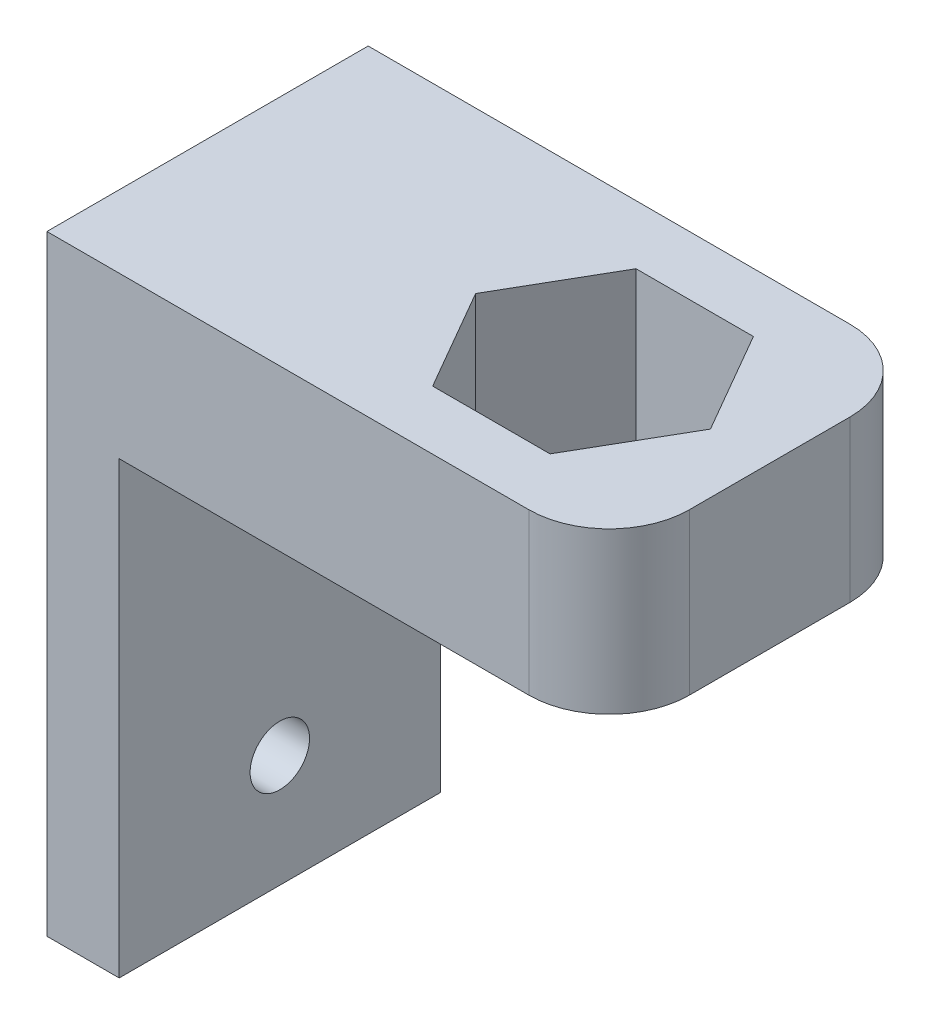
ISO-10303-21;
HEADER;
FILE_DESCRIPTION(('STEP AP214'),'2;1');
FILE_NAME('part.step','',(''),(''),'','','');
FILE_SCHEMA(('AUTOMOTIVE_DESIGN { 1 0 10303 214 1 1 1 1 }'));
ENDSEC;
DATA;
#1=APPLICATION_CONTEXT('core data for automotive mechanical design processes');
#2=APPLICATION_PROTOCOL_DEFINITION('international standard','automotive_design',2000,#1);
#3=PRODUCT_CONTEXT('',#1,'mechanical');
#4=PRODUCT('Part','Part','',(#3));
#5=PRODUCT_RELATED_PRODUCT_CATEGORY('part','',(#4));
#6=PRODUCT_DEFINITION_FORMATION('','',#4);
#7=PRODUCT_DEFINITION_CONTEXT('part definition',#1,'design');
#8=PRODUCT_DEFINITION('design','',#6,#7);
#9=PRODUCT_DEFINITION_SHAPE('','',#8);
#10=(LENGTH_UNIT() NAMED_UNIT(*) SI_UNIT(.MILLI.,.METRE.));
#11=(NAMED_UNIT(*) PLANE_ANGLE_UNIT() SI_UNIT($,.RADIAN.));
#12=(NAMED_UNIT(*) SI_UNIT($,.STERADIAN.) SOLID_ANGLE_UNIT());
#13=UNCERTAINTY_MEASURE_WITH_UNIT(LENGTH_MEASURE(1.E-05),#10,'distance_accuracy_value','');
#14=(GEOMETRIC_REPRESENTATION_CONTEXT(3) GLOBAL_UNCERTAINTY_ASSIGNED_CONTEXT((#13)) GLOBAL_UNIT_ASSIGNED_CONTEXT((#10,
#11,#12)) REPRESENTATION_CONTEXT('',''));
#15=CARTESIAN_POINT('',(0.,0.,0.));
#16=DIRECTION('',(0.,0.,1.));
#17=DIRECTION('',(1.,0.,0.));
#18=AXIS2_PLACEMENT_3D('',#15,#16,#17);
#19=CARTESIAN_POINT('',(17.5,10.,10.));
#20=DIRECTION('',(-1.,0.,0.));
#21=DIRECTION('',(0.,0.,1.));
#22=AXIS2_PLACEMENT_3D('',#19,#20,#21);
#23=PLANE('',#22);
#24=DIRECTION('',(0.,0.,-1.));
#25=VECTOR('',#24,1.);
#26=CARTESIAN_POINT('',(17.5,0.,10.));
#27=LINE('',#26,#25);
#28=CARTESIAN_POINT('',(17.5,0.,5.));
#29=VERTEX_POINT('',#28);
#30=CARTESIAN_POINT('',(17.5,0.,-5.));
#31=VERTEX_POINT('',#30);
#32=EDGE_CURVE('E206',#29,#31,#27,.T.);
#33=ORIENTED_EDGE('',*,*,#32,.T.);
#34=DIRECTION('',(0.,-1.,0.));
#35=VECTOR('',#34,1.);
#36=CARTESIAN_POINT('',(17.5,10.,-5.));
#37=LINE('',#36,#35);
#38=CARTESIAN_POINT('',(17.5,10.,-5.));
#39=VERTEX_POINT('',#38);
#40=EDGE_CURVE('E236',#31,#39,#37,.F.);
#41=ORIENTED_EDGE('',*,*,#40,.T.);
#42=DIRECTION('',(0.,0.,-1.));
#43=VECTOR('',#42,1.);
#44=CARTESIAN_POINT('',(17.5,10.,10.));
#45=LINE('',#44,#43);
#46=CARTESIAN_POINT('',(17.5,10.,5.));
#47=VERTEX_POINT('',#46);
#48=EDGE_CURVE('E217',#47,#39,#45,.T.);
#49=ORIENTED_EDGE('',*,*,#48,.F.);
#50=DIRECTION('',(0.,-1.,0.));
#51=VECTOR('',#50,1.);
#52=CARTESIAN_POINT('',(17.5,10.,5.));
#53=LINE('',#52,#51);
#54=EDGE_CURVE('E238',#47,#29,#53,.T.);
#55=ORIENTED_EDGE('',*,*,#54,.T.);
#56=EDGE_LOOP('',(#33,#41,#49,#55));
#57=FACE_BOUND('',#56,.T.);
#58=ADVANCED_FACE('F32',(#57),#23,.F.);
#59=CARTESIAN_POINT('',(-17.5,10.,-10.));
#60=DIRECTION('',(0.,0.,1.));
#61=DIRECTION('',(1.,0.,0.));
#62=AXIS2_PLACEMENT_3D('',#59,#60,#61);
#63=PLANE('',#62);
#64=DIRECTION('',(-1.,0.,0.));
#65=VECTOR('',#64,1.);
#66=CARTESIAN_POINT('',(-17.5,10.,-10.));
#67=LINE('',#66,#65);
#68=CARTESIAN_POINT('',(12.5,10.,-10.));
#69=VERTEX_POINT('',#68);
#70=CARTESIAN_POINT('',(-17.5,10.,-10.));
#71=VERTEX_POINT('',#70);
#72=EDGE_CURVE('E220',#69,#71,#67,.T.);
#73=ORIENTED_EDGE('',*,*,#72,.F.);
#74=DIRECTION('',(0.,-1.,0.));
#75=VECTOR('',#74,1.);
#76=CARTESIAN_POINT('',(12.5,10.,-10.));
#77=LINE('',#76,#75);
#78=CARTESIAN_POINT('',(12.5,0.,-10.));
#79=VERTEX_POINT('',#78);
#80=EDGE_CURVE('E145',#69,#79,#77,.T.);
#81=ORIENTED_EDGE('',*,*,#80,.T.);
#82=DIRECTION('',(-1.,0.,0.));
#83=VECTOR('',#82,1.);
#84=CARTESIAN_POINT('',(-17.5,0.,-10.));
#85=LINE('',#84,#83);
#86=CARTESIAN_POINT('',(-13.,0.,-10.));
#87=VERTEX_POINT('',#86);
#88=EDGE_CURVE('E228',#79,#87,#85,.T.);
#89=ORIENTED_EDGE('',*,*,#88,.T.);
#90=DIRECTION('',(0.,1.,0.));
#91=VECTOR('',#90,1.);
#92=CARTESIAN_POINT('',(-13.,-28.,-10.));
#93=LINE('',#92,#91);
#94=CARTESIAN_POINT('',(-13.,-28.,-10.));
#95=VERTEX_POINT('',#94);
#96=EDGE_CURVE('E152',#95,#87,#93,.T.);
#97=ORIENTED_EDGE('',*,*,#96,.F.);
#98=DIRECTION('',(1.,0.,0.));
#99=VECTOR('',#98,1.);
#100=CARTESIAN_POINT('',(-17.5,-28.,-10.));
#101=LINE('',#100,#99);
#102=CARTESIAN_POINT('',(-17.5,-28.,-10.));
#103=VERTEX_POINT('',#102);
#104=EDGE_CURVE('E149',#103,#95,#101,.T.);
#105=ORIENTED_EDGE('',*,*,#104,.F.);
#106=DIRECTION('',(0.,-1.,0.));
#107=VECTOR('',#106,1.);
#108=CARTESIAN_POINT('',(-17.5,10.,-10.));
#109=LINE('',#108,#107);
#110=EDGE_CURVE('E136',#71,#103,#109,.T.);
#111=ORIENTED_EDGE('',*,*,#110,.F.);
#112=EDGE_LOOP('',(#73,#81,#89,#97,#105,#111));
#113=FACE_BOUND('',#112,.T.);
#114=ADVANCED_FACE('F150',(#113),#63,.F.);
#115=CARTESIAN_POINT('',(-17.5,10.,10.));
#116=DIRECTION('',(1.,0.,0.));
#117=DIRECTION('',(0.,0.,-1.));
#118=AXIS2_PLACEMENT_3D('',#115,#116,#117);
#119=PLANE('',#118);
#120=CARTESIAN_POINT('',(-17.5,-6.,0.));
#121=DIRECTION('',(1.,0.,0.));
#122=DIRECTION('',(0.,0.,-1.));
#123=AXIS2_PLACEMENT_3D('',#120,#121,#122);
#124=CIRCLE('',#123,1.85);
#125=CARTESIAN_POINT('',(-17.5,-6.,-1.85));
#126=VERTEX_POINT('',#125);
#127=EDGE_CURVE('E328',#126,#126,#124,.T.);
#128=ORIENTED_EDGE('',*,*,#127,.T.);
#129=EDGE_LOOP('',(#128));
#130=FACE_BOUND('',#129,.T.);
#131=CARTESIAN_POINT('',(-17.5,-21.,0.));
#132=DIRECTION('',(1.,0.,0.));
#133=DIRECTION('',(0.,0.,-1.));
#134=AXIS2_PLACEMENT_3D('',#131,#132,#133);
#135=CIRCLE('',#134,1.85);
#136=CARTESIAN_POINT('',(-17.5,-21.,-1.85));
#137=VERTEX_POINT('',#136);
#138=EDGE_CURVE('E162',#137,#137,#135,.T.);
#139=ORIENTED_EDGE('',*,*,#138,.T.);
#140=EDGE_LOOP('',(#139));
#141=FACE_BOUND('',#140,.T.);
#142=ORIENTED_EDGE('',*,*,#110,.T.);
#143=DIRECTION('',(0.,0.,-1.));
#144=VECTOR('',#143,1.);
#145=CARTESIAN_POINT('',(-17.5,-28.,10.));
#146=LINE('',#145,#144);
#147=CARTESIAN_POINT('',(-17.5,-28.,10.));
#148=VERTEX_POINT('',#147);
#149=EDGE_CURVE('E141',#148,#103,#146,.T.);
#150=ORIENTED_EDGE('',*,*,#149,.F.);
#151=DIRECTION('',(0.,-1.,0.));
#152=VECTOR('',#151,1.);
#153=CARTESIAN_POINT('',(-17.5,10.,10.));
#154=LINE('',#153,#152);
#155=CARTESIAN_POINT('',(-17.5,10.,10.));
#156=VERTEX_POINT('',#155);
#157=EDGE_CURVE('E146',#156,#148,#154,.T.);
#158=ORIENTED_EDGE('',*,*,#157,.F.);
#159=DIRECTION('',(0.,0.,1.));
#160=VECTOR('',#159,1.);
#161=CARTESIAN_POINT('',(-17.5,10.,10.));
#162=LINE('',#161,#160);
#163=EDGE_CURVE('E142',#71,#156,#162,.T.);
#164=ORIENTED_EDGE('',*,*,#163,.F.);
#165=EDGE_LOOP('',(#142,#150,#158,#164));
#166=FACE_BOUND('',#165,.T.);
#167=ADVANCED_FACE('F138',(#130,#141,#166),#119,.F.);
#168=CARTESIAN_POINT('',(-17.5,10.,10.));
#169=DIRECTION('',(0.,0.,-1.));
#170=DIRECTION('',(-1.,0.,0.));
#171=AXIS2_PLACEMENT_3D('',#168,#169,#170);
#172=PLANE('',#171);
#173=ORIENTED_EDGE('',*,*,#157,.T.);
#174=DIRECTION('',(-1.,0.,0.));
#175=VECTOR('',#174,1.);
#176=CARTESIAN_POINT('',(-17.5,-28.,10.));
#177=LINE('',#176,#175);
#178=CARTESIAN_POINT('',(-13.,-28.,10.));
#179=VERTEX_POINT('',#178);
#180=EDGE_CURVE('E160',#179,#148,#177,.T.);
#181=ORIENTED_EDGE('',*,*,#180,.F.);
#182=DIRECTION('',(0.,1.,0.));
#183=VECTOR('',#182,1.);
#184=CARTESIAN_POINT('',(-13.,-28.,10.));
#185=LINE('',#184,#183);
#186=CARTESIAN_POINT('',(-13.,0.,10.));
#187=VERTEX_POINT('',#186);
#188=EDGE_CURVE('E170',#179,#187,#185,.T.);
#189=ORIENTED_EDGE('',*,*,#188,.T.);
#190=DIRECTION('',(1.,0.,0.));
#191=VECTOR('',#190,1.);
#192=CARTESIAN_POINT('',(-17.5,0.,10.));
#193=LINE('',#192,#191);
#194=CARTESIAN_POINT('',(12.5,0.,10.));
#195=VERTEX_POINT('',#194);
#196=EDGE_CURVE('E177',#187,#195,#193,.T.);
#197=ORIENTED_EDGE('',*,*,#196,.T.);
#198=DIRECTION('',(0.,-1.,0.));
#199=VECTOR('',#198,1.);
#200=CARTESIAN_POINT('',(12.5,10.,10.));
#201=LINE('',#200,#199);
#202=CARTESIAN_POINT('',(12.5,10.,10.));
#203=VERTEX_POINT('',#202);
#204=EDGE_CURVE('E11',#195,#203,#201,.F.);
#205=ORIENTED_EDGE('',*,*,#204,.T.);
#206=DIRECTION('',(1.,0.,0.));
#207=VECTOR('',#206,1.);
#208=CARTESIAN_POINT('',(-17.5,10.,10.));
#209=LINE('',#208,#207);
#210=EDGE_CURVE('E223',#156,#203,#209,.T.);
#211=ORIENTED_EDGE('',*,*,#210,.F.);
#212=EDGE_LOOP('',(#173,#181,#189,#197,#205,#211));
#213=FACE_BOUND('',#212,.T.);
#214=ADVANCED_FACE('F249',(#213),#172,.F.);
#215=CARTESIAN_POINT('',(0.,10.,0.));
#216=DIRECTION('',(0.,-1.,0.));
#217=DIRECTION('',(0.,0.,-1.));
#218=AXIS2_PLACEMENT_3D('',#215,#216,#217);
#219=PLANE('',#218);
#220=DIRECTION('',(0.5,0.,-0.866025403784439));
#221=VECTOR('',#220,1.);
#222=CARTESIAN_POINT('',(10.1546272039703,10.,6.33));
#223=LINE('',#222,#221);
#224=CARTESIAN_POINT('',(10.1546272039703,10.,6.33));
#225=VERTEX_POINT('',#224);
#226=CARTESIAN_POINT('',(13.8092544079407,10.,0.));
#227=VERTEX_POINT('',#226);
#228=EDGE_CURVE('E184',#225,#227,#223,.T.);
#229=ORIENTED_EDGE('',*,*,#228,.F.);
#230=DIRECTION('',(1.,0.,0.));
#231=VECTOR('',#230,1.);
#232=CARTESIAN_POINT('',(2.84537279602967,10.,6.33));
#233=LINE('',#232,#231);
#234=CARTESIAN_POINT('',(2.84537279602967,10.,6.33));
#235=VERTEX_POINT('',#234);
#236=EDGE_CURVE('E57',#235,#225,#233,.T.);
#237=ORIENTED_EDGE('',*,*,#236,.F.);
#238=DIRECTION('',(0.5,0.,0.866025403784438));
#239=VECTOR('',#238,1.);
#240=CARTESIAN_POINT('',(-0.809254407940667,10.,0.));
#241=LINE('',#240,#239);
#242=CARTESIAN_POINT('',(-0.809254407940667,10.,0.));
#243=VERTEX_POINT('',#242);
#244=EDGE_CURVE('E201',#243,#235,#241,.T.);
#245=ORIENTED_EDGE('',*,*,#244,.F.);
#246=DIRECTION('',(-0.5,0.,0.866025403784439));
#247=VECTOR('',#246,1.);
#248=CARTESIAN_POINT('',(2.84537279602967,10.,-6.33));
#249=LINE('',#248,#247);
#250=CARTESIAN_POINT('',(2.84537279602967,10.,-6.33));
#251=VERTEX_POINT('',#250);
#252=EDGE_CURVE('E198',#251,#243,#249,.T.);
#253=ORIENTED_EDGE('',*,*,#252,.F.);
#254=DIRECTION('',(-1.,0.,0.));
#255=VECTOR('',#254,1.);
#256=CARTESIAN_POINT('',(10.1546272039703,10.,-6.33));
#257=LINE('',#256,#255);
#258=CARTESIAN_POINT('',(10.1546272039703,10.,-6.33));
#259=VERTEX_POINT('',#258);
#260=EDGE_CURVE('E195',#259,#251,#257,.T.);
#261=ORIENTED_EDGE('',*,*,#260,.F.);
#262=DIRECTION('',(-0.5,0.,-0.866025403784438));
#263=VECTOR('',#262,1.);
#264=CARTESIAN_POINT('',(13.8092544079407,10.,0.));
#265=LINE('',#264,#263);
#266=EDGE_CURVE('E187',#227,#259,#265,.T.);
#267=ORIENTED_EDGE('',*,*,#266,.F.);
#268=EDGE_LOOP('',(#229,#237,#245,#253,#261,#267));
#269=FACE_BOUND('',#268,.T.);
#270=ORIENTED_EDGE('',*,*,#48,.T.);
#271=CARTESIAN_POINT('',(12.5,10.,-5.));
#272=DIRECTION('',(0.,-1.,0.));
#273=DIRECTION('',(0.,0.,-1.));
#274=AXIS2_PLACEMENT_3D('',#271,#272,#273);
#275=CIRCLE('',#274,5.);
#276=EDGE_CURVE('E41',#39,#69,#275,.F.);
#277=ORIENTED_EDGE('',*,*,#276,.T.);
#278=ORIENTED_EDGE('',*,*,#72,.T.);
#279=ORIENTED_EDGE('',*,*,#163,.T.);
#280=ORIENTED_EDGE('',*,*,#210,.T.);
#281=CARTESIAN_POINT('',(12.5,10.,5.));
#282=DIRECTION('',(0.,-1.,0.));
#283=DIRECTION('',(0.,0.,-1.));
#284=AXIS2_PLACEMENT_3D('',#281,#282,#283);
#285=CIRCLE('',#284,5.);
#286=EDGE_CURVE('E234',#203,#47,#285,.F.);
#287=ORIENTED_EDGE('',*,*,#286,.T.);
#288=EDGE_LOOP('',(#270,#277,#278,#279,#280,#287));
#289=FACE_BOUND('',#288,.T.);
#290=ADVANCED_FACE('F253',(#269,#289),#219,.F.);
#291=CARTESIAN_POINT('',(0.,0.,0.));
#292=DIRECTION('',(0.,-1.,0.));
#293=DIRECTION('',(0.,0.,-1.));
#294=AXIS2_PLACEMENT_3D('',#291,#292,#293);
#295=PLANE('',#294);
#296=DIRECTION('',(0.,0.,1.));
#297=VECTOR('',#296,1.);
#298=CARTESIAN_POINT('',(-13.,0.,10.));
#299=LINE('',#298,#297);
#300=EDGE_CURVE('E49',#87,#187,#299,.T.);
#301=ORIENTED_EDGE('',*,*,#300,.F.);
#302=ORIENTED_EDGE('',*,*,#88,.F.);
#303=CARTESIAN_POINT('',(12.5,0.,-5.));
#304=DIRECTION('',(0.,-1.,0.));
#305=DIRECTION('',(0.,0.,-1.));
#306=AXIS2_PLACEMENT_3D('',#303,#304,#305);
#307=CIRCLE('',#306,5.);
#308=EDGE_CURVE('E241',#79,#31,#307,.T.);
#309=ORIENTED_EDGE('',*,*,#308,.T.);
#310=ORIENTED_EDGE('',*,*,#32,.F.);
#311=CARTESIAN_POINT('',(12.5,0.,5.));
#312=DIRECTION('',(0.,-1.,0.));
#313=DIRECTION('',(0.,0.,-1.));
#314=AXIS2_PLACEMENT_3D('',#311,#312,#313);
#315=CIRCLE('',#314,5.);
#316=EDGE_CURVE('E243',#29,#195,#315,.T.);
#317=ORIENTED_EDGE('',*,*,#316,.T.);
#318=ORIENTED_EDGE('',*,*,#196,.F.);
#319=EDGE_LOOP('',(#301,#302,#309,#310,#317,#318));
#320=FACE_BOUND('',#319,.T.);
#321=DIRECTION('',(1.,0.,0.));
#322=VECTOR('',#321,1.);
#323=CARTESIAN_POINT('',(2.84537279602967,0.,6.33));
#324=LINE('',#323,#322);
#325=CARTESIAN_POINT('',(2.84537279602967,0.,6.33));
#326=VERTEX_POINT('',#325);
#327=CARTESIAN_POINT('',(10.1546272039703,0.,6.33));
#328=VERTEX_POINT('',#327);
#329=EDGE_CURVE('E173',#326,#328,#324,.T.);
#330=ORIENTED_EDGE('',*,*,#329,.T.);
#331=DIRECTION('',(0.5,0.,-0.866025403784439));
#332=VECTOR('',#331,1.);
#333=CARTESIAN_POINT('',(10.1546272039703,0.,6.33));
#334=LINE('',#333,#332);
#335=CARTESIAN_POINT('',(13.8092544079407,0.,0.));
#336=VERTEX_POINT('',#335);
#337=EDGE_CURVE('E463',#328,#336,#334,.T.);
#338=ORIENTED_EDGE('',*,*,#337,.T.);
#339=DIRECTION('',(-0.5,0.,-0.866025403784438));
#340=VECTOR('',#339,1.);
#341=CARTESIAN_POINT('',(13.8092544079407,0.,0.));
#342=LINE('',#341,#340);
#343=CARTESIAN_POINT('',(10.1546272039703,0.,-6.33));
#344=VERTEX_POINT('',#343);
#345=EDGE_CURVE('E471',#336,#344,#342,.T.);
#346=ORIENTED_EDGE('',*,*,#345,.T.);
#347=DIRECTION('',(-1.,0.,0.));
#348=VECTOR('',#347,1.);
#349=CARTESIAN_POINT('',(10.1546272039703,0.,-6.33));
#350=LINE('',#349,#348);
#351=CARTESIAN_POINT('',(2.84537279602967,0.,-6.33));
#352=VERTEX_POINT('',#351);
#353=EDGE_CURVE('E470',#344,#352,#350,.T.);
#354=ORIENTED_EDGE('',*,*,#353,.T.);
#355=DIRECTION('',(-0.5,0.,0.866025403784439));
#356=VECTOR('',#355,1.);
#357=CARTESIAN_POINT('',(2.84537279602967,0.,-6.33));
#358=LINE('',#357,#356);
#359=CARTESIAN_POINT('',(-0.809254407940667,0.,0.));
#360=VERTEX_POINT('',#359);
#361=EDGE_CURVE('E469',#352,#360,#358,.T.);
#362=ORIENTED_EDGE('',*,*,#361,.T.);
#363=DIRECTION('',(0.5,0.,0.866025403784438));
#364=VECTOR('',#363,1.);
#365=CARTESIAN_POINT('',(-0.809254407940667,0.,0.));
#366=LINE('',#365,#364);
#367=EDGE_CURVE('E190',#360,#326,#366,.T.);
#368=ORIENTED_EDGE('',*,*,#367,.T.);
#369=EDGE_LOOP('',(#330,#338,#346,#354,#362,#368));
#370=FACE_BOUND('',#369,.T.);
#371=ADVANCED_FACE('F260',(#320,#370),#295,.T.);
#372=CARTESIAN_POINT('',(12.5,10.,-5.));
#373=DIRECTION('',(0.,-1.,0.));
#374=DIRECTION('',(0.,0.,-1.));
#375=AXIS2_PLACEMENT_3D('',#372,#373,#374);
#376=CYLINDRICAL_SURFACE('',#375,5.);
#377=ORIENTED_EDGE('',*,*,#276,.F.);
#378=ORIENTED_EDGE('',*,*,#40,.F.);
#379=ORIENTED_EDGE('',*,*,#308,.F.);
#380=ORIENTED_EDGE('',*,*,#80,.F.);
#381=EDGE_LOOP('',(#377,#378,#379,#380));
#382=FACE_BOUND('',#381,.T.);
#383=ADVANCED_FACE('F265',(#382),#376,.T.);
#384=CARTESIAN_POINT('',(12.5,10.,5.));
#385=DIRECTION('',(0.,-1.,0.));
#386=DIRECTION('',(0.,0.,-1.));
#387=AXIS2_PLACEMENT_3D('',#384,#385,#386);
#388=CYLINDRICAL_SURFACE('',#387,5.);
#389=ORIENTED_EDGE('',*,*,#286,.F.);
#390=ORIENTED_EDGE('',*,*,#204,.F.);
#391=ORIENTED_EDGE('',*,*,#316,.F.);
#392=ORIENTED_EDGE('',*,*,#54,.F.);
#393=EDGE_LOOP('',(#389,#390,#391,#392));
#394=FACE_BOUND('',#393,.T.);
#395=ADVANCED_FACE('F34',(#394),#388,.T.);
#396=CARTESIAN_POINT('',(2.84537279602967,0.,6.33));
#397=DIRECTION('',(0.,0.,1.));
#398=DIRECTION('',(1.,0.,0.));
#399=AXIS2_PLACEMENT_3D('',#396,#397,#398);
#400=PLANE('',#399);
#401=ORIENTED_EDGE('',*,*,#236,.T.);
#402=DIRECTION('',(0.,1.,0.));
#403=VECTOR('',#402,1.);
#404=CARTESIAN_POINT('',(10.1546272039703,0.,6.33));
#405=LINE('',#404,#403);
#406=EDGE_CURVE('E215',#328,#225,#405,.T.);
#407=ORIENTED_EDGE('',*,*,#406,.F.);
#408=ORIENTED_EDGE('',*,*,#329,.F.);
#409=DIRECTION('',(0.,1.,0.));
#410=VECTOR('',#409,1.);
#411=CARTESIAN_POINT('',(2.84537279602967,0.,6.33));
#412=LINE('',#411,#410);
#413=EDGE_CURVE('E204',#326,#235,#412,.T.);
#414=ORIENTED_EDGE('',*,*,#413,.T.);
#415=EDGE_LOOP('',(#401,#407,#408,#414));
#416=FACE_BOUND('',#415,.T.);
#417=ADVANCED_FACE('F271',(#416),#400,.F.);
#418=CARTESIAN_POINT('',(-0.809254407940667,0.,0.));
#419=DIRECTION('',(-0.866025403784438,0.,0.5));
#420=DIRECTION('',(0.5,0.,0.866025403784439));
#421=AXIS2_PLACEMENT_3D('',#418,#419,#420);
#422=PLANE('',#421);
#423=ORIENTED_EDGE('',*,*,#244,.T.);
#424=ORIENTED_EDGE('',*,*,#413,.F.);
#425=ORIENTED_EDGE('',*,*,#367,.F.);
#426=DIRECTION('',(0.,1.,0.));
#427=VECTOR('',#426,1.);
#428=CARTESIAN_POINT('',(-0.809254407940667,0.,0.));
#429=LINE('',#428,#427);
#430=EDGE_CURVE('E207',#360,#243,#429,.T.);
#431=ORIENTED_EDGE('',*,*,#430,.T.);
#432=EDGE_LOOP('',(#423,#424,#425,#431));
#433=FACE_BOUND('',#432,.T.);
#434=ADVANCED_FACE('F290',(#433),#422,.F.);
#435=CARTESIAN_POINT('',(2.84537279602967,0.,-6.33));
#436=DIRECTION('',(-0.866025403784439,0.,-0.5));
#437=DIRECTION('',(-0.5,0.,0.866025403784439));
#438=AXIS2_PLACEMENT_3D('',#435,#436,#437);
#439=PLANE('',#438);
#440=ORIENTED_EDGE('',*,*,#252,.T.);
#441=ORIENTED_EDGE('',*,*,#430,.F.);
#442=ORIENTED_EDGE('',*,*,#361,.F.);
#443=DIRECTION('',(0.,1.,0.));
#444=VECTOR('',#443,1.);
#445=CARTESIAN_POINT('',(2.84537279602967,0.,-6.33));
#446=LINE('',#445,#444);
#447=EDGE_CURVE('E209',#352,#251,#446,.T.);
#448=ORIENTED_EDGE('',*,*,#447,.T.);
#449=EDGE_LOOP('',(#440,#441,#442,#448));
#450=FACE_BOUND('',#449,.T.);
#451=ADVANCED_FACE('F303',(#450),#439,.F.);
#452=CARTESIAN_POINT('',(10.1546272039703,0.,-6.33));
#453=DIRECTION('',(0.,0.,-1.));
#454=DIRECTION('',(-1.,0.,0.));
#455=AXIS2_PLACEMENT_3D('',#452,#453,#454);
#456=PLANE('',#455);
#457=ORIENTED_EDGE('',*,*,#260,.T.);
#458=ORIENTED_EDGE('',*,*,#447,.F.);
#459=ORIENTED_EDGE('',*,*,#353,.F.);
#460=DIRECTION('',(0.,1.,0.));
#461=VECTOR('',#460,1.);
#462=CARTESIAN_POINT('',(10.1546272039703,0.,-6.33));
#463=LINE('',#462,#461);
#464=EDGE_CURVE('E211',#344,#259,#463,.T.);
#465=ORIENTED_EDGE('',*,*,#464,.T.);
#466=EDGE_LOOP('',(#457,#458,#459,#465));
#467=FACE_BOUND('',#466,.T.);
#468=ADVANCED_FACE('F299',(#467),#456,.F.);
#469=CARTESIAN_POINT('',(13.8092544079407,0.,0.));
#470=DIRECTION('',(0.866025403784438,0.,-0.5));
#471=DIRECTION('',(-0.5,0.,-0.866025403784438));
#472=AXIS2_PLACEMENT_3D('',#469,#470,#471);
#473=PLANE('',#472);
#474=ORIENTED_EDGE('',*,*,#266,.T.);
#475=ORIENTED_EDGE('',*,*,#464,.F.);
#476=ORIENTED_EDGE('',*,*,#345,.F.);
#477=DIRECTION('',(0.,1.,0.));
#478=VECTOR('',#477,1.);
#479=CARTESIAN_POINT('',(13.8092544079407,0.,0.));
#480=LINE('',#479,#478);
#481=EDGE_CURVE('E213',#336,#227,#480,.T.);
#482=ORIENTED_EDGE('',*,*,#481,.T.);
#483=EDGE_LOOP('',(#474,#475,#476,#482));
#484=FACE_BOUND('',#483,.T.);
#485=ADVANCED_FACE('F295',(#484),#473,.F.);
#486=CARTESIAN_POINT('',(10.1546272039703,0.,6.33));
#487=DIRECTION('',(0.866025403784439,0.,0.5));
#488=DIRECTION('',(0.5,0.,-0.866025403784439));
#489=AXIS2_PLACEMENT_3D('',#486,#487,#488);
#490=PLANE('',#489);
#491=ORIENTED_EDGE('',*,*,#228,.T.);
#492=ORIENTED_EDGE('',*,*,#481,.F.);
#493=ORIENTED_EDGE('',*,*,#337,.F.);
#494=ORIENTED_EDGE('',*,*,#406,.T.);
#495=EDGE_LOOP('',(#491,#492,#493,#494));
#496=FACE_BOUND('',#495,.T.);
#497=ADVANCED_FACE('F291',(#496),#490,.F.);
#498=CARTESIAN_POINT('',(-13.,-28.,10.));
#499=DIRECTION('',(-1.,0.,0.));
#500=DIRECTION('',(0.,0.,1.));
#501=AXIS2_PLACEMENT_3D('',#498,#499,#500);
#502=PLANE('',#501);
#503=CARTESIAN_POINT('',(-13.,-6.,0.));
#504=DIRECTION('',(1.,0.,0.));
#505=DIRECTION('',(0.,0.,-1.));
#506=AXIS2_PLACEMENT_3D('',#503,#504,#505);
#507=CIRCLE('',#506,1.85);
#508=CARTESIAN_POINT('',(-13.,-6.,-1.85));
#509=VERTEX_POINT('',#508);
#510=EDGE_CURVE('E331',#509,#509,#507,.T.);
#511=ORIENTED_EDGE('',*,*,#510,.F.);
#512=EDGE_LOOP('',(#511));
#513=FACE_BOUND('',#512,.T.);
#514=CARTESIAN_POINT('',(-13.,-21.,0.));
#515=DIRECTION('',(1.,0.,0.));
#516=DIRECTION('',(0.,0.,-1.));
#517=AXIS2_PLACEMENT_3D('',#514,#515,#516);
#518=CIRCLE('',#517,1.85);
#519=CARTESIAN_POINT('',(-13.,-21.,-1.85));
#520=VERTEX_POINT('',#519);
#521=EDGE_CURVE('E165',#520,#520,#518,.T.);
#522=ORIENTED_EDGE('',*,*,#521,.F.);
#523=EDGE_LOOP('',(#522));
#524=FACE_BOUND('',#523,.T.);
#525=ORIENTED_EDGE('',*,*,#300,.T.);
#526=ORIENTED_EDGE('',*,*,#188,.F.);
#527=DIRECTION('',(0.,0.,1.));
#528=VECTOR('',#527,1.);
#529=CARTESIAN_POINT('',(-13.,-28.,10.));
#530=LINE('',#529,#528);
#531=EDGE_CURVE('E155',#95,#179,#530,.T.);
#532=ORIENTED_EDGE('',*,*,#531,.F.);
#533=ORIENTED_EDGE('',*,*,#96,.T.);
#534=EDGE_LOOP('',(#525,#526,#532,#533));
#535=FACE_BOUND('',#534,.T.);
#536=ADVANCED_FACE('F294',(#513,#524,#535),#502,.F.);
#537=CARTESIAN_POINT('',(0.,-28.,0.));
#538=DIRECTION('',(0.,-1.,0.));
#539=DIRECTION('',(0.,0.,-1.));
#540=AXIS2_PLACEMENT_3D('',#537,#538,#539);
#541=PLANE('',#540);
#542=ORIENTED_EDGE('',*,*,#149,.T.);
#543=ORIENTED_EDGE('',*,*,#104,.T.);
#544=ORIENTED_EDGE('',*,*,#531,.T.);
#545=ORIENTED_EDGE('',*,*,#180,.T.);
#546=EDGE_LOOP('',(#542,#543,#544,#545));
#547=FACE_BOUND('',#546,.T.);
#548=ADVANCED_FACE('F158',(#547),#541,.T.);
#549=CARTESIAN_POINT('',(-17.5,-21.,0.));
#550=DIRECTION('',(1.,0.,0.));
#551=DIRECTION('',(0.,0.,-1.));
#552=AXIS2_PLACEMENT_3D('',#549,#550,#551);
#553=CYLINDRICAL_SURFACE('',#552,1.85);
#554=ORIENTED_EDGE('',*,*,#138,.F.);
#555=EDGE_LOOP('',(#554));
#556=FACE_BOUND('',#555,.T.);
#557=ORIENTED_EDGE('',*,*,#521,.T.);
#558=EDGE_LOOP('',(#557));
#559=FACE_BOUND('',#558,.T.);
#560=ADVANCED_FACE('F316',(#556,#559),#553,.F.);
#561=CARTESIAN_POINT('',(-17.5,-6.,0.));
#562=DIRECTION('',(1.,0.,0.));
#563=DIRECTION('',(0.,0.,-1.));
#564=AXIS2_PLACEMENT_3D('',#561,#562,#563);
#565=CYLINDRICAL_SURFACE('',#564,1.85);
#566=ORIENTED_EDGE('',*,*,#127,.F.);
#567=EDGE_LOOP('',(#566));
#568=FACE_BOUND('',#567,.T.);
#569=ORIENTED_EDGE('',*,*,#510,.T.);
#570=EDGE_LOOP('',(#569));
#571=FACE_BOUND('',#570,.T.);
#572=ADVANCED_FACE('F319',(#568,#571),#565,.F.);
#573=CLOSED_SHELL('',(#58,#114,#167,#214,#290,#371,#383,#395,#417,#434,#451,#468,#485,#497,#536,
#548,#560,#572));
#574=MANIFOLD_SOLID_BREP('B2',#573);
#575=ADVANCED_BREP_SHAPE_REPRESENTATION('',(#18,#574),#14);
#576=SHAPE_DEFINITION_REPRESENTATION(#9,#575);
ENDSEC;
END-ISO-10303-21;
